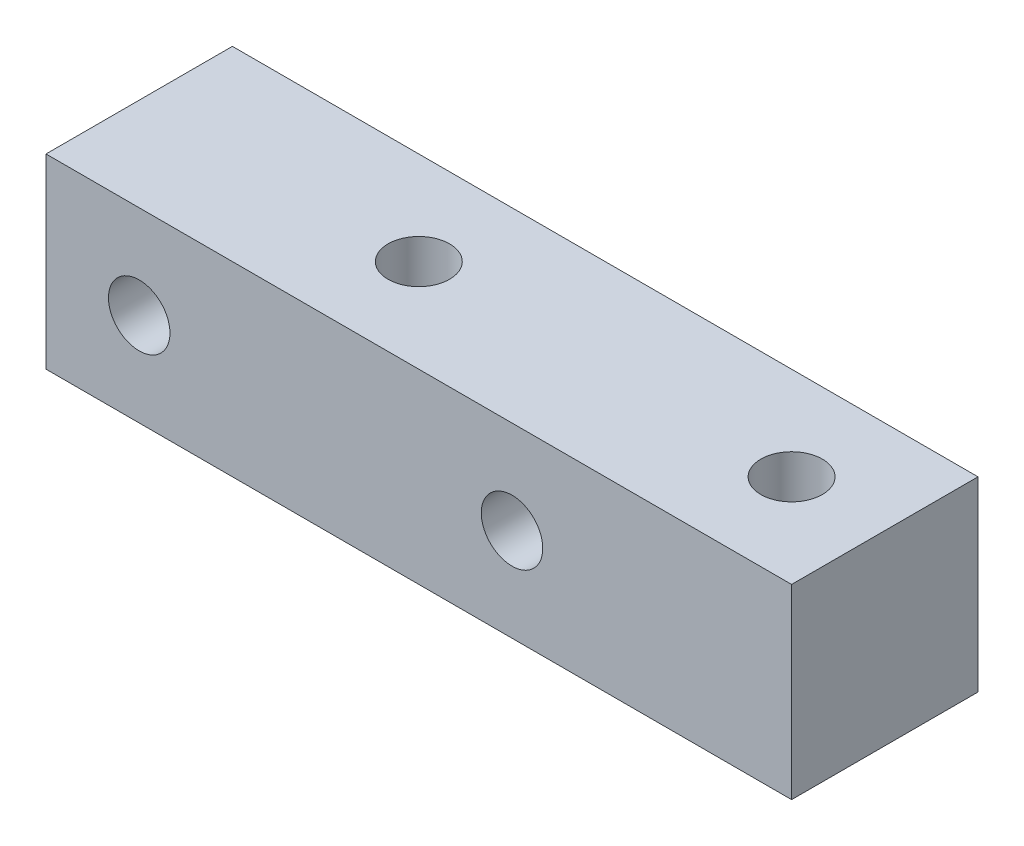
ISO-10303-21;
HEADER;
FILE_DESCRIPTION(('STEP AP214'),'2;1');
FILE_NAME('part.step','',(''),(''),'','','');
FILE_SCHEMA(('AUTOMOTIVE_DESIGN { 1 0 10303 214 1 1 1 1 }'));
ENDSEC;
DATA;
#1=APPLICATION_CONTEXT('core data for automotive mechanical design processes');
#2=APPLICATION_PROTOCOL_DEFINITION('international standard','automotive_design',2000,#1);
#3=PRODUCT_CONTEXT('',#1,'mechanical');
#4=PRODUCT('Part','Part','',(#3));
#5=PRODUCT_RELATED_PRODUCT_CATEGORY('part','',(#4));
#6=PRODUCT_DEFINITION_FORMATION('','',#4);
#7=PRODUCT_DEFINITION_CONTEXT('part definition',#1,'design');
#8=PRODUCT_DEFINITION('design','',#6,#7);
#9=PRODUCT_DEFINITION_SHAPE('','',#8);
#10=(LENGTH_UNIT() NAMED_UNIT(*) SI_UNIT(.MILLI.,.METRE.));
#11=(NAMED_UNIT(*) PLANE_ANGLE_UNIT() SI_UNIT($,.RADIAN.));
#12=(NAMED_UNIT(*) SI_UNIT($,.STERADIAN.) SOLID_ANGLE_UNIT());
#13=UNCERTAINTY_MEASURE_WITH_UNIT(LENGTH_MEASURE(1.E-05),#10,'distance_accuracy_value','');
#14=(GEOMETRIC_REPRESENTATION_CONTEXT(3) GLOBAL_UNCERTAINTY_ASSIGNED_CONTEXT((#13)) GLOBAL_UNIT_ASSIGNED_CONTEXT((#10,
#11,#12)) REPRESENTATION_CONTEXT('',''));
#15=CARTESIAN_POINT('',(0.,0.,0.));
#16=DIRECTION('',(0.,0.,1.));
#17=DIRECTION('',(1.,0.,0.));
#18=AXIS2_PLACEMENT_3D('',#15,#16,#17);
#19=CARTESIAN_POINT('',(-20.,-5.,10.));
#20=DIRECTION('',(1.,0.,0.));
#21=DIRECTION('',(0.,0.,-1.));
#22=AXIS2_PLACEMENT_3D('',#19,#20,#21);
#23=PLANE('',#22);
#24=DIRECTION('',(0.,-1.,0.));
#25=VECTOR('',#24,1.);
#26=CARTESIAN_POINT('',(-20.,-5.,0.));
#27=LINE('',#26,#25);
#28=CARTESIAN_POINT('',(-20.,5.,0.));
#29=VERTEX_POINT('',#28);
#30=CARTESIAN_POINT('',(-20.,-5.,0.));
#31=VERTEX_POINT('',#30);
#32=EDGE_CURVE('E107',#29,#31,#27,.T.);
#33=ORIENTED_EDGE('',*,*,#32,.T.);
#34=DIRECTION('',(0.,0.,-1.));
#35=VECTOR('',#34,1.);
#36=CARTESIAN_POINT('',(-20.,-5.,10.));
#37=LINE('',#36,#35);
#38=CARTESIAN_POINT('',(-20.,-5.,10.));
#39=VERTEX_POINT('',#38);
#40=EDGE_CURVE('E11',#39,#31,#37,.T.);
#41=ORIENTED_EDGE('',*,*,#40,.F.);
#42=DIRECTION('',(0.,-1.,0.));
#43=VECTOR('',#42,1.);
#44=CARTESIAN_POINT('',(-20.,-5.,10.));
#45=LINE('',#44,#43);
#46=CARTESIAN_POINT('',(-20.,5.,10.));
#47=VERTEX_POINT('',#46);
#48=EDGE_CURVE('E91',#47,#39,#45,.T.);
#49=ORIENTED_EDGE('',*,*,#48,.F.);
#50=DIRECTION('',(0.,0.,-1.));
#51=VECTOR('',#50,1.);
#52=CARTESIAN_POINT('',(-20.,5.,10.));
#53=LINE('',#52,#51);
#54=EDGE_CURVE('E103',#47,#29,#53,.T.);
#55=ORIENTED_EDGE('',*,*,#54,.T.);
#56=EDGE_LOOP('',(#33,#41,#49,#55));
#57=FACE_BOUND('',#56,.T.);
#58=ADVANCED_FACE('F39',(#57),#23,.F.);
#59=CARTESIAN_POINT('',(20.,-5.,10.));
#60=DIRECTION('',(0.,1.,0.));
#61=DIRECTION('',(-1.,0.,0.));
#62=AXIS2_PLACEMENT_3D('',#59,#60,#61);
#63=PLANE('',#62);
#64=CARTESIAN_POINT('',(-5.00000000000001,-5.,5.));
#65=DIRECTION('',(0.,1.,0.));
#66=DIRECTION('',(0.,0.,1.));
#67=AXIS2_PLACEMENT_3D('',#64,#65,#66);
#68=CIRCLE('',#67,1.65);
#69=CARTESIAN_POINT('',(-5.00000000000001,-5.,6.65));
#70=VERTEX_POINT('',#69);
#71=EDGE_CURVE('E151',#70,#70,#68,.T.);
#72=ORIENTED_EDGE('',*,*,#71,.T.);
#73=EDGE_LOOP('',(#72));
#74=FACE_BOUND('',#73,.T.);
#75=CARTESIAN_POINT('',(15.,-5.,5.));
#76=DIRECTION('',(0.,1.,0.));
#77=DIRECTION('',(0.,0.,1.));
#78=AXIS2_PLACEMENT_3D('',#75,#76,#77);
#79=CIRCLE('',#78,1.65);
#80=CARTESIAN_POINT('',(15.,-5.,6.65));
#81=VERTEX_POINT('',#80);
#82=EDGE_CURVE('E143',#81,#81,#79,.T.);
#83=ORIENTED_EDGE('',*,*,#82,.T.);
#84=EDGE_LOOP('',(#83));
#85=FACE_BOUND('',#84,.T.);
#86=DIRECTION('',(1.,0.,0.));
#87=VECTOR('',#86,1.);
#88=CARTESIAN_POINT('',(20.,-5.,0.));
#89=LINE('',#88,#87);
#90=CARTESIAN_POINT('',(20.,-5.,0.));
#91=VERTEX_POINT('',#90);
#92=EDGE_CURVE('E96',#31,#91,#89,.T.);
#93=ORIENTED_EDGE('',*,*,#92,.T.);
#94=DIRECTION('',(0.,0.,-1.));
#95=VECTOR('',#94,1.);
#96=CARTESIAN_POINT('',(20.,-5.,10.));
#97=LINE('',#96,#95);
#98=CARTESIAN_POINT('',(20.,-5.,10.));
#99=VERTEX_POINT('',#98);
#100=EDGE_CURVE('E48',#99,#91,#97,.T.);
#101=ORIENTED_EDGE('',*,*,#100,.F.);
#102=DIRECTION('',(1.,0.,0.));
#103=VECTOR('',#102,1.);
#104=CARTESIAN_POINT('',(20.,-5.,10.));
#105=LINE('',#104,#103);
#106=EDGE_CURVE('E86',#39,#99,#105,.T.);
#107=ORIENTED_EDGE('',*,*,#106,.F.);
#108=ORIENTED_EDGE('',*,*,#40,.T.);
#109=EDGE_LOOP('',(#93,#101,#107,#108));
#110=FACE_BOUND('',#109,.T.);
#111=ADVANCED_FACE('F95',(#74,#85,#110),#63,.F.);
#112=CARTESIAN_POINT('',(20.,-5.,10.));
#113=DIRECTION('',(-1.,0.,0.));
#114=DIRECTION('',(0.,0.,1.));
#115=AXIS2_PLACEMENT_3D('',#112,#113,#114);
#116=PLANE('',#115);
#117=DIRECTION('',(0.,1.,0.));
#118=VECTOR('',#117,1.);
#119=CARTESIAN_POINT('',(20.,-5.,0.));
#120=LINE('',#119,#118);
#121=CARTESIAN_POINT('',(20.,5.,0.));
#122=VERTEX_POINT('',#121);
#123=EDGE_CURVE('E73',#91,#122,#120,.T.);
#124=ORIENTED_EDGE('',*,*,#123,.T.);
#125=DIRECTION('',(0.,0.,-1.));
#126=VECTOR('',#125,1.);
#127=CARTESIAN_POINT('',(20.,5.,10.));
#128=LINE('',#127,#126);
#129=CARTESIAN_POINT('',(20.,5.,10.));
#130=VERTEX_POINT('',#129);
#131=EDGE_CURVE('E98',#130,#122,#128,.T.);
#132=ORIENTED_EDGE('',*,*,#131,.F.);
#133=DIRECTION('',(0.,1.,0.));
#134=VECTOR('',#133,1.);
#135=CARTESIAN_POINT('',(20.,-5.,10.));
#136=LINE('',#135,#134);
#137=EDGE_CURVE('E89',#99,#130,#136,.T.);
#138=ORIENTED_EDGE('',*,*,#137,.F.);
#139=ORIENTED_EDGE('',*,*,#100,.T.);
#140=EDGE_LOOP('',(#124,#132,#138,#139));
#141=FACE_BOUND('',#140,.T.);
#142=ADVANCED_FACE('F99',(#141),#116,.F.);
#143=CARTESIAN_POINT('',(20.,5.,10.));
#144=DIRECTION('',(0.,-1.,0.));
#145=DIRECTION('',(1.,0.,0.));
#146=AXIS2_PLACEMENT_3D('',#143,#144,#145);
#147=PLANE('',#146);
#148=CARTESIAN_POINT('',(-5.00000000000001,5.,5.));
#149=DIRECTION('',(0.,1.,0.));
#150=DIRECTION('',(0.,0.,1.));
#151=AXIS2_PLACEMENT_3D('',#148,#149,#150);
#152=CIRCLE('',#151,1.65);
#153=CARTESIAN_POINT('',(-5.00000000000001,5.,6.65));
#154=VERTEX_POINT('',#153);
#155=EDGE_CURVE('E155',#154,#154,#152,.T.);
#156=ORIENTED_EDGE('',*,*,#155,.F.);
#157=EDGE_LOOP('',(#156));
#158=FACE_BOUND('',#157,.T.);
#159=CARTESIAN_POINT('',(15.,5.,5.));
#160=DIRECTION('',(0.,1.,0.));
#161=DIRECTION('',(0.,0.,1.));
#162=AXIS2_PLACEMENT_3D('',#159,#160,#161);
#163=CIRCLE('',#162,1.65);
#164=CARTESIAN_POINT('',(15.,5.,6.65));
#165=VERTEX_POINT('',#164);
#166=EDGE_CURVE('E147',#165,#165,#163,.T.);
#167=ORIENTED_EDGE('',*,*,#166,.F.);
#168=EDGE_LOOP('',(#167));
#169=FACE_BOUND('',#168,.T.);
#170=DIRECTION('',(-1.,0.,0.));
#171=VECTOR('',#170,1.);
#172=CARTESIAN_POINT('',(20.,5.,0.));
#173=LINE('',#172,#171);
#174=EDGE_CURVE('E79',#122,#29,#173,.T.);
#175=ORIENTED_EDGE('',*,*,#174,.T.);
#176=ORIENTED_EDGE('',*,*,#54,.F.);
#177=DIRECTION('',(-1.,0.,0.));
#178=VECTOR('',#177,1.);
#179=CARTESIAN_POINT('',(20.,5.,10.));
#180=LINE('',#179,#178);
#181=EDGE_CURVE('E56',#130,#47,#180,.T.);
#182=ORIENTED_EDGE('',*,*,#181,.F.);
#183=ORIENTED_EDGE('',*,*,#131,.T.);
#184=EDGE_LOOP('',(#175,#176,#182,#183));
#185=FACE_BOUND('',#184,.T.);
#186=ADVANCED_FACE('F121',(#158,#169,#185),#147,.F.);
#187=CARTESIAN_POINT('',(0.,0.,10.));
#188=DIRECTION('',(0.,0.,1.));
#189=DIRECTION('',(1.,0.,0.));
#190=AXIS2_PLACEMENT_3D('',#187,#188,#189);
#191=PLANE('',#190);
#192=CARTESIAN_POINT('',(4.99999999999999,0.,10.));
#193=DIRECTION('',(0.,0.,1.));
#194=DIRECTION('',(1.,0.,0.));
#195=AXIS2_PLACEMENT_3D('',#192,#193,#194);
#196=CIRCLE('',#195,1.65);
#197=CARTESIAN_POINT('',(6.64999999999999,0.,10.));
#198=VERTEX_POINT('',#197);
#199=EDGE_CURVE('E139',#198,#198,#196,.T.);
#200=ORIENTED_EDGE('',*,*,#199,.F.);
#201=EDGE_LOOP('',(#200));
#202=FACE_BOUND('',#201,.T.);
#203=CARTESIAN_POINT('',(-15.,0.,10.));
#204=DIRECTION('',(0.,0.,1.));
#205=DIRECTION('',(1.,0.,0.));
#206=AXIS2_PLACEMENT_3D('',#203,#204,#205);
#207=CIRCLE('',#206,1.65);
#208=CARTESIAN_POINT('',(-13.35,0.,10.));
#209=VERTEX_POINT('',#208);
#210=EDGE_CURVE('E131',#209,#209,#207,.T.);
#211=ORIENTED_EDGE('',*,*,#210,.F.);
#212=EDGE_LOOP('',(#211));
#213=FACE_BOUND('',#212,.T.);
#214=ORIENTED_EDGE('',*,*,#48,.T.);
#215=ORIENTED_EDGE('',*,*,#106,.T.);
#216=ORIENTED_EDGE('',*,*,#137,.T.);
#217=ORIENTED_EDGE('',*,*,#181,.T.);
#218=EDGE_LOOP('',(#214,#215,#216,#217));
#219=FACE_BOUND('',#218,.T.);
#220=ADVANCED_FACE('F87',(#202,#213,#219),#191,.T.);
#221=CARTESIAN_POINT('',(0.,0.,0.));
#222=DIRECTION('',(0.,0.,1.));
#223=DIRECTION('',(1.,0.,0.));
#224=AXIS2_PLACEMENT_3D('',#221,#222,#223);
#225=PLANE('',#224);
#226=CARTESIAN_POINT('',(4.99999999999999,0.,0.));
#227=DIRECTION('',(0.,0.,1.));
#228=DIRECTION('',(1.,0.,0.));
#229=AXIS2_PLACEMENT_3D('',#226,#227,#228);
#230=CIRCLE('',#229,1.65);
#231=CARTESIAN_POINT('',(6.64999999999999,0.,0.));
#232=VERTEX_POINT('',#231);
#233=EDGE_CURVE('E135',#232,#232,#230,.T.);
#234=ORIENTED_EDGE('',*,*,#233,.T.);
#235=EDGE_LOOP('',(#234));
#236=FACE_BOUND('',#235,.T.);
#237=CARTESIAN_POINT('',(-15.,0.,0.));
#238=DIRECTION('',(0.,0.,1.));
#239=DIRECTION('',(1.,0.,0.));
#240=AXIS2_PLACEMENT_3D('',#237,#238,#239);
#241=CIRCLE('',#240,1.65);
#242=CARTESIAN_POINT('',(-13.35,0.,0.));
#243=VERTEX_POINT('',#242);
#244=EDGE_CURVE('E111',#243,#243,#241,.T.);
#245=ORIENTED_EDGE('',*,*,#244,.T.);
#246=EDGE_LOOP('',(#245));
#247=FACE_BOUND('',#246,.T.);
#248=ORIENTED_EDGE('',*,*,#32,.F.);
#249=ORIENTED_EDGE('',*,*,#174,.F.);
#250=ORIENTED_EDGE('',*,*,#123,.F.);
#251=ORIENTED_EDGE('',*,*,#92,.F.);
#252=EDGE_LOOP('',(#248,#249,#250,#251));
#253=FACE_BOUND('',#252,.T.);
#254=ADVANCED_FACE('F124',(#236,#247,#253),#225,.F.);
#255=CARTESIAN_POINT('',(-15.,0.,10.));
#256=DIRECTION('',(0.,0.,1.));
#257=DIRECTION('',(1.,0.,0.));
#258=AXIS2_PLACEMENT_3D('',#255,#256,#257);
#259=CYLINDRICAL_SURFACE('',#258,1.65);
#260=ORIENTED_EDGE('',*,*,#244,.F.);
#261=EDGE_LOOP('',(#260));
#262=FACE_BOUND('',#261,.T.);
#263=ORIENTED_EDGE('',*,*,#210,.T.);
#264=EDGE_LOOP('',(#263));
#265=FACE_BOUND('',#264,.T.);
#266=ADVANCED_FACE('F178',(#262,#265),#259,.F.);
#267=CARTESIAN_POINT('',(4.99999999999999,0.,10.));
#268=DIRECTION('',(0.,0.,1.));
#269=DIRECTION('',(1.,0.,0.));
#270=AXIS2_PLACEMENT_3D('',#267,#268,#269);
#271=CYLINDRICAL_SURFACE('',#270,1.65);
#272=ORIENTED_EDGE('',*,*,#233,.F.);
#273=EDGE_LOOP('',(#272));
#274=FACE_BOUND('',#273,.T.);
#275=ORIENTED_EDGE('',*,*,#199,.T.);
#276=EDGE_LOOP('',(#275));
#277=FACE_BOUND('',#276,.T.);
#278=ADVANCED_FACE('F169',(#274,#277),#271,.F.);
#279=CARTESIAN_POINT('',(15.,5.,5.));
#280=DIRECTION('',(0.,1.,0.));
#281=DIRECTION('',(0.,0.,1.));
#282=AXIS2_PLACEMENT_3D('',#279,#280,#281);
#283=CYLINDRICAL_SURFACE('',#282,1.65);
#284=ORIENTED_EDGE('',*,*,#82,.F.);
#285=EDGE_LOOP('',(#284));
#286=FACE_BOUND('',#285,.T.);
#287=ORIENTED_EDGE('',*,*,#166,.T.);
#288=EDGE_LOOP('',(#287));
#289=FACE_BOUND('',#288,.T.);
#290=ADVANCED_FACE('F167',(#286,#289),#283,.F.);
#291=CARTESIAN_POINT('',(-5.00000000000001,5.,5.));
#292=DIRECTION('',(0.,1.,0.));
#293=DIRECTION('',(0.,0.,1.));
#294=AXIS2_PLACEMENT_3D('',#291,#292,#293);
#295=CYLINDRICAL_SURFACE('',#294,1.65);
#296=ORIENTED_EDGE('',*,*,#71,.F.);
#297=EDGE_LOOP('',(#296));
#298=FACE_BOUND('',#297,.T.);
#299=ORIENTED_EDGE('',*,*,#155,.T.);
#300=EDGE_LOOP('',(#299));
#301=FACE_BOUND('',#300,.T.);
#302=ADVANCED_FACE('F160',(#298,#301),#295,.F.);
#303=CLOSED_SHELL('',(#58,#111,#142,#186,#220,#254,#266,#278,#290,#302));
#304=MANIFOLD_SOLID_BREP('B2',#303);
#305=ADVANCED_BREP_SHAPE_REPRESENTATION('',(#18,#304),#14);
#306=SHAPE_DEFINITION_REPRESENTATION(#9,#305);
ENDSEC;
END-ISO-10303-21;
